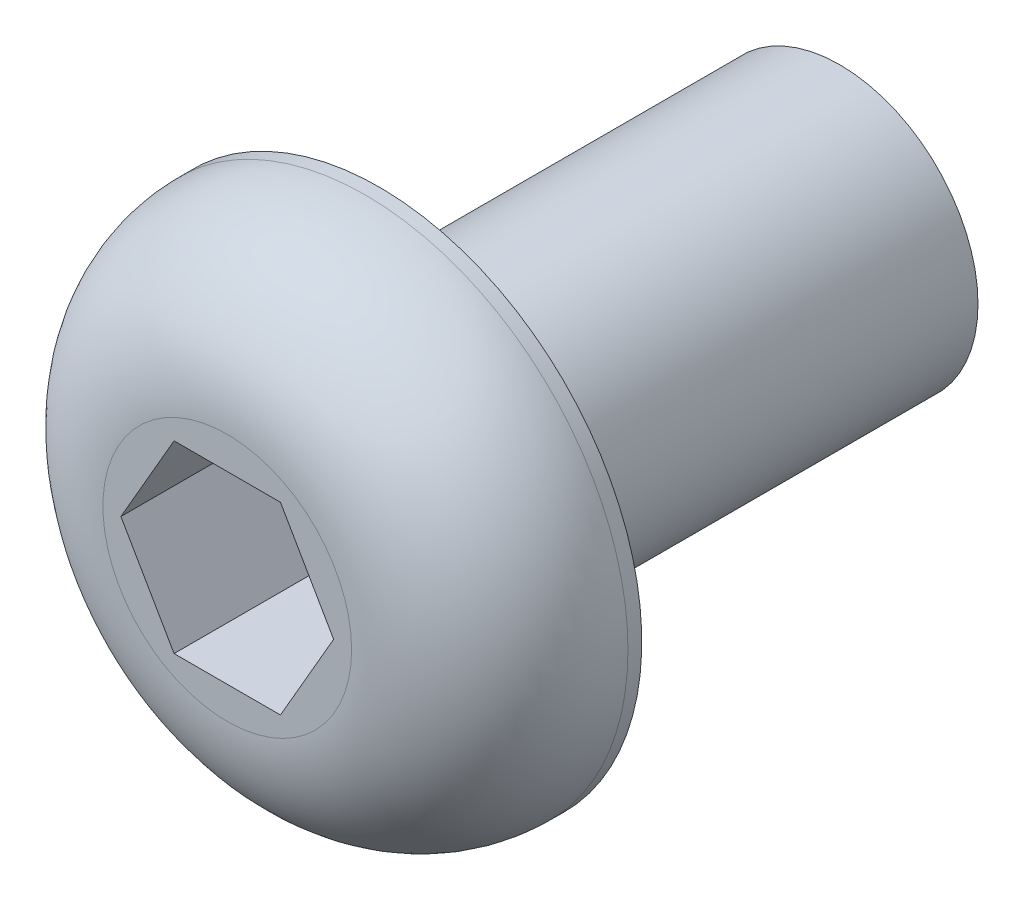
ISO-10303-21;
HEADER;
FILE_DESCRIPTION(('STEP AP214'),'2;1');
FILE_NAME('part.step','',(''),(''),'','','');
FILE_SCHEMA(('AUTOMOTIVE_DESIGN { 1 0 10303 214 1 1 1 1 }'));
ENDSEC;
DATA;
#1=APPLICATION_CONTEXT('core data for automotive mechanical design processes');
#2=APPLICATION_PROTOCOL_DEFINITION('international standard','automotive_design',2000,#1);
#3=PRODUCT_CONTEXT('',#1,'mechanical');
#4=PRODUCT('Part','Part','',(#3));
#5=PRODUCT_RELATED_PRODUCT_CATEGORY('part','',(#4));
#6=PRODUCT_DEFINITION_FORMATION('','',#4);
#7=PRODUCT_DEFINITION_CONTEXT('part definition',#1,'design');
#8=PRODUCT_DEFINITION('design','',#6,#7);
#9=PRODUCT_DEFINITION_SHAPE('','',#8);
#10=(LENGTH_UNIT() NAMED_UNIT(*) SI_UNIT(.MILLI.,.METRE.));
#11=(NAMED_UNIT(*) PLANE_ANGLE_UNIT() SI_UNIT($,.RADIAN.));
#12=(NAMED_UNIT(*) SI_UNIT($,.STERADIAN.) SOLID_ANGLE_UNIT());
#13=UNCERTAINTY_MEASURE_WITH_UNIT(LENGTH_MEASURE(1.E-05),#10,'distance_accuracy_value','');
#14=(GEOMETRIC_REPRESENTATION_CONTEXT(3) GLOBAL_UNCERTAINTY_ASSIGNED_CONTEXT((#13)) GLOBAL_UNIT_ASSIGNED_CONTEXT((#10,
#11,#12)) REPRESENTATION_CONTEXT('',''));
#15=CARTESIAN_POINT('',(0.,0.,0.));
#16=DIRECTION('',(0.,0.,1.));
#17=DIRECTION('',(1.,0.,0.));
#18=AXIS2_PLACEMENT_3D('',#15,#16,#17);
#19=CARTESIAN_POINT('',(1.518,-1.518,-5.));
#20=DIRECTION('',(0.,0.,-1.));
#21=DIRECTION('',(-1.,0.,0.));
#22=AXIS2_PLACEMENT_3D('',#19,#20,#21);
#23=PLANE('',#22);
#24=CARTESIAN_POINT('',(0.,0.,-5.));
#25=DIRECTION('',(0.,0.,1.));
#26=DIRECTION('',(0.,-1.,0.));
#27=AXIS2_PLACEMENT_3D('',#24,#25,#26);
#28=CIRCLE('',#27,1.5);
#29=CARTESIAN_POINT('',(0.,-1.5,-5.));
#30=VERTEX_POINT('',#29);
#31=EDGE_CURVE('E21',#30,#30,#28,.F.);
#32=ORIENTED_EDGE('',*,*,#31,.T.);
#33=EDGE_LOOP('',(#32));
#34=FACE_BOUND('',#33,.T.);
#35=ADVANCED_FACE('F17',(#34),#23,.T.);
#36=CARTESIAN_POINT('',(0.,0.,-5.));
#37=DIRECTION('',(0.,0.,1.));
#38=DIRECTION('',(0.,-1.,0.));
#39=AXIS2_PLACEMENT_3D('',#36,#37,#38);
#40=CYLINDRICAL_SURFACE('',#39,1.5);
#41=ORIENTED_EDGE('',*,*,#31,.F.);
#42=EDGE_LOOP('',(#41));
#43=FACE_BOUND('',#42,.T.);
#44=CARTESIAN_POINT('',(0.,0.,0.));
#45=DIRECTION('',(0.,0.,1.));
#46=DIRECTION('',(0.,-1.,0.));
#47=AXIS2_PLACEMENT_3D('',#44,#45,#46);
#48=CIRCLE('',#47,1.5);
#49=CARTESIAN_POINT('',(0.,-1.5,0.));
#50=VERTEX_POINT('',#49);
#51=EDGE_CURVE('E90',#50,#50,#48,.F.);
#52=ORIENTED_EDGE('',*,*,#51,.T.);
#53=EDGE_LOOP('',(#52));
#54=FACE_BOUND('',#53,.T.);
#55=ADVANCED_FACE('F127',(#43,#54),#40,.T.);
#56=CARTESIAN_POINT('',(1.154700538,-1.,0.05));
#57=DIRECTION('',(0.,0.,-1.));
#58=DIRECTION('',(-1.,0.,0.));
#59=AXIS2_PLACEMENT_3D('',#56,#57,#58);
#60=PLANE('',#59);
#61=DIRECTION('',(-1.,0.,0.));
#62=VECTOR('',#61,1.);
#63=CARTESIAN_POINT('',(0.,1.,0.05));
#64=LINE('',#63,#62);
#65=CARTESIAN_POINT('',(0.577350269,1.,0.05));
#66=VERTEX_POINT('',#65);
#67=CARTESIAN_POINT('',(-0.577350269,1.,0.05));
#68=VERTEX_POINT('',#67);
#69=EDGE_CURVE('E65',#66,#68,#64,.T.);
#70=ORIENTED_EDGE('',*,*,#69,.T.);
#71=DIRECTION('',(-0.499999999876835,-0.866025403855548,0.));
#72=VECTOR('',#71,1.);
#73=CARTESIAN_POINT('',(-0.8660254035,0.5,0.05));
#74=LINE('',#73,#72);
#75=CARTESIAN_POINT('',(-1.15470053767725,-5.59017025378306E-10,0.05));
#76=VERTEX_POINT('',#75);
#77=EDGE_CURVE('E108',#68,#76,#74,.T.);
#78=ORIENTED_EDGE('',*,*,#77,.T.);
#79=DIRECTION('',(0.499999999876835,-0.866025403855548,0.));
#80=VECTOR('',#79,1.);
#81=CARTESIAN_POINT('',(-0.8660254035,-0.5,0.05));
#82=LINE('',#81,#80);
#83=CARTESIAN_POINT('',(-0.577350269,-1.,0.05));
#84=VERTEX_POINT('',#83);
#85=EDGE_CURVE('E102',#76,#84,#82,.T.);
#86=ORIENTED_EDGE('',*,*,#85,.T.);
#87=DIRECTION('',(1.,0.,0.));
#88=VECTOR('',#87,1.);
#89=CARTESIAN_POINT('',(0.,-1.,0.05));
#90=LINE('',#89,#88);
#91=CARTESIAN_POINT('',(0.577350269,-1.,0.05));
#92=VERTEX_POINT('',#91);
#93=EDGE_CURVE('E76',#84,#92,#90,.T.);
#94=ORIENTED_EDGE('',*,*,#93,.T.);
#95=DIRECTION('',(0.499999999876835,0.866025403855548,0.));
#96=VECTOR('',#95,1.);
#97=CARTESIAN_POINT('',(0.8660254035,-0.5,0.05));
#98=LINE('',#97,#96);
#99=CARTESIAN_POINT('',(1.15470053767725,-5.59017025378306E-10,0.05));
#100=VERTEX_POINT('',#99);
#101=EDGE_CURVE('E78',#92,#100,#98,.T.);
#102=ORIENTED_EDGE('',*,*,#101,.T.);
#103=DIRECTION('',(-0.499999999876835,0.866025403855548,0.));
#104=VECTOR('',#103,1.);
#105=CARTESIAN_POINT('',(0.8660254035,0.5,0.05));
#106=LINE('',#105,#104);
#107=EDGE_CURVE('E81',#100,#66,#106,.T.);
#108=ORIENTED_EDGE('',*,*,#107,.T.);
#109=EDGE_LOOP('',(#70,#78,#86,#94,#102,#108));
#110=FACE_BOUND('',#109,.T.);
#111=ADVANCED_FACE('F80',(#110),#60,.F.);
#112=CARTESIAN_POINT('',(-2.8842,-2.8842,0.));
#113=DIRECTION('',(0.,0.,1.));
#114=DIRECTION('',(1.,0.,0.));
#115=AXIS2_PLACEMENT_3D('',#112,#113,#114);
#116=PLANE('',#115);
#117=ORIENTED_EDGE('',*,*,#51,.F.);
#118=EDGE_LOOP('',(#117));
#119=FACE_BOUND('',#118,.T.);
#120=CARTESIAN_POINT('',(0.,0.,0.));
#121=DIRECTION('',(0.,0.,-1.));
#122=DIRECTION('',(-1.,0.,0.));
#123=AXIS2_PLACEMENT_3D('',#120,#121,#122);
#124=CIRCLE('',#123,2.85);
#125=CARTESIAN_POINT('',(-2.85,0.,0.));
#126=VERTEX_POINT('',#125);
#127=EDGE_CURVE('E118',#126,#126,#124,.T.);
#128=ORIENTED_EDGE('',*,*,#127,.T.);
#129=EDGE_LOOP('',(#128));
#130=FACE_BOUND('',#129,.T.);
#131=ADVANCED_FACE('F135',(#119,#130),#116,.F.);
#132=CARTESIAN_POINT('',(1.154700538,0.,0.05));
#133=DIRECTION('',(0.866025403855548,0.499999999876835,0.));
#134=DIRECTION('',(-0.499999999876835,0.866025403855548,0.));
#135=AXIS2_PLACEMENT_3D('',#132,#133,#134);
#136=PLANE('',#135);
#137=DIRECTION('',(0.,0.,-1.));
#138=VECTOR('',#137,1.);
#139=CARTESIAN_POINT('',(0.577350269,1.,0.85));
#140=LINE('',#139,#138);
#141=CARTESIAN_POINT('',(0.5773502694658,1.0000000003111,1.65));
#142=VERTEX_POINT('',#141);
#143=EDGE_CURVE('E89',#142,#66,#140,.T.);
#144=ORIENTED_EDGE('',*,*,#143,.T.);
#145=ORIENTED_EDGE('',*,*,#107,.F.);
#146=DIRECTION('',(0.,0.,1.));
#147=VECTOR('',#146,1.);
#148=CARTESIAN_POINT('',(1.154700538,0.,0.85));
#149=LINE('',#148,#147);
#150=CARTESIAN_POINT('',(1.15470053740243,-9.40933987246678E-11,1.65));
#151=VERTEX_POINT('',#150);
#152=EDGE_CURVE('E85',#100,#151,#149,.T.);
#153=ORIENTED_EDGE('',*,*,#152,.T.);
#154=DIRECTION('',(0.49999999855163,-0.866025404620655,0.));
#155=VECTOR('',#154,1.);
#156=CARTESIAN_POINT('',(0.5773502699316,1.0000000004148,1.65));
#157=LINE('',#156,#155);
#158=EDGE_CURVE('E56',#142,#151,#157,.T.);
#159=ORIENTED_EDGE('',*,*,#158,.F.);
#160=EDGE_LOOP('',(#144,#145,#153,#159));
#161=FACE_BOUND('',#160,.T.);
#162=ADVANCED_FACE('F87',(#161),#136,.F.);
#163=CARTESIAN_POINT('',(0.577350269,-1.,0.05));
#164=DIRECTION('',(0.866025403855548,-0.499999999876835,0.));
#165=DIRECTION('',(0.499999999876835,0.866025403855548,0.));
#166=AXIS2_PLACEMENT_3D('',#163,#164,#165);
#167=PLANE('',#166);
#168=ORIENTED_EDGE('',*,*,#152,.F.);
#169=ORIENTED_EDGE('',*,*,#101,.F.);
#170=DIRECTION('',(0.,0.,1.));
#171=VECTOR('',#170,1.);
#172=CARTESIAN_POINT('',(0.577350269,-1.,0.85));
#173=LINE('',#172,#171);
#174=CARTESIAN_POINT('',(0.5773502694658,-1.0000000003111,1.65));
#175=VERTEX_POINT('',#174);
#176=EDGE_CURVE('E96',#92,#175,#173,.T.);
#177=ORIENTED_EDGE('',*,*,#176,.T.);
#178=DIRECTION('',(-0.49999999855163,-0.866025404620655,0.));
#179=VECTOR('',#178,1.);
#180=CARTESIAN_POINT('',(1.1547005371308,0.,1.65));
#181=LINE('',#180,#179);
#182=EDGE_CURVE('E94',#151,#175,#181,.T.);
#183=ORIENTED_EDGE('',*,*,#182,.F.);
#184=EDGE_LOOP('',(#168,#169,#177,#183));
#185=FACE_BOUND('',#184,.T.);
#186=ADVANCED_FACE('F92',(#185),#167,.F.);
#187=CARTESIAN_POINT('',(-0.577350269,-1.,1.65));
#188=DIRECTION('',(0.,-1.,0.));
#189=DIRECTION('',(0.,0.,-1.));
#190=AXIS2_PLACEMENT_3D('',#187,#188,#189);
#191=PLANE('',#190);
#192=ORIENTED_EDGE('',*,*,#176,.F.);
#193=ORIENTED_EDGE('',*,*,#93,.F.);
#194=DIRECTION('',(0.,0.,1.));
#195=VECTOR('',#194,1.);
#196=CARTESIAN_POINT('',(-0.577350269,-1.,0.85));
#197=LINE('',#196,#195);
#198=CARTESIAN_POINT('',(-0.5773502694658,-1.0000000003111,1.65));
#199=VERTEX_POINT('',#198);
#200=EDGE_CURVE('E107',#84,#199,#197,.T.);
#201=ORIENTED_EDGE('',*,*,#200,.T.);
#202=DIRECTION('',(-1.,0.,0.));
#203=VECTOR('',#202,1.);
#204=CARTESIAN_POINT('',(0.,-1.0000000004148,1.65));
#205=LINE('',#204,#203);
#206=EDGE_CURVE('E103',#175,#199,#205,.T.);
#207=ORIENTED_EDGE('',*,*,#206,.F.);
#208=EDGE_LOOP('',(#192,#193,#201,#207));
#209=FACE_BOUND('',#208,.T.);
#210=ADVANCED_FACE('F170',(#209),#191,.F.);
#211=CARTESIAN_POINT('',(-1.154700538,0.,0.05));
#212=DIRECTION('',(-0.866025403855548,-0.499999999876835,0.));
#213=DIRECTION('',(0.499999999876835,-0.866025403855548,0.));
#214=AXIS2_PLACEMENT_3D('',#211,#212,#213);
#215=PLANE('',#214);
#216=ORIENTED_EDGE('',*,*,#200,.F.);
#217=ORIENTED_EDGE('',*,*,#85,.F.);
#218=DIRECTION('',(0.,0.,1.));
#219=VECTOR('',#218,1.);
#220=CARTESIAN_POINT('',(-1.154700538,0.,0.85));
#221=LINE('',#220,#219);
#222=CARTESIAN_POINT('',(-1.15470053740243,9.40937636698738E-11,1.65));
#223=VERTEX_POINT('',#222);
#224=EDGE_CURVE('E157',#76,#223,#221,.T.);
#225=ORIENTED_EDGE('',*,*,#224,.T.);
#226=DIRECTION('',(-0.499999998551631,0.866025404620655,0.));
#227=VECTOR('',#226,1.);
#228=CARTESIAN_POINT('',(-0.5773502699316,-1.0000000004148,1.65));
#229=LINE('',#228,#227);
#230=EDGE_CURVE('E106',#199,#223,#229,.T.);
#231=ORIENTED_EDGE('',*,*,#230,.F.);
#232=EDGE_LOOP('',(#216,#217,#225,#231));
#233=FACE_BOUND('',#232,.T.);
#234=ADVANCED_FACE('F165',(#233),#215,.F.);
#235=CARTESIAN_POINT('',(-0.577350269,1.,0.05));
#236=DIRECTION('',(-0.866025403855548,0.499999999876835,0.));
#237=DIRECTION('',(-0.499999999876835,-0.866025403855548,0.));
#238=AXIS2_PLACEMENT_3D('',#235,#236,#237);
#239=PLANE('',#238);
#240=ORIENTED_EDGE('',*,*,#224,.F.);
#241=ORIENTED_EDGE('',*,*,#77,.F.);
#242=DIRECTION('',(0.,0.,1.));
#243=VECTOR('',#242,1.);
#244=CARTESIAN_POINT('',(-0.577350269,1.,0.85));
#245=LINE('',#244,#243);
#246=CARTESIAN_POINT('',(-0.5773502694658,1.0000000003111,1.65));
#247=VERTEX_POINT('',#246);
#248=EDGE_CURVE('E36',#68,#247,#245,.T.);
#249=ORIENTED_EDGE('',*,*,#248,.T.);
#250=DIRECTION('',(0.49999999855163,0.866025404620655,0.));
#251=VECTOR('',#250,1.);
#252=CARTESIAN_POINT('',(-1.1547005371308,0.,1.65));
#253=LINE('',#252,#251);
#254=EDGE_CURVE('E110',#223,#247,#253,.T.);
#255=ORIENTED_EDGE('',*,*,#254,.F.);
#256=EDGE_LOOP('',(#240,#241,#249,#255));
#257=FACE_BOUND('',#256,.T.);
#258=ADVANCED_FACE('F166',(#257),#239,.F.);
#259=CARTESIAN_POINT('',(0.577350269,1.,0.05));
#260=DIRECTION('',(0.,1.,0.));
#261=DIRECTION('',(-1.,0.,0.));
#262=AXIS2_PLACEMENT_3D('',#259,#260,#261);
#263=PLANE('',#262);
#264=ORIENTED_EDGE('',*,*,#248,.F.);
#265=ORIENTED_EDGE('',*,*,#69,.F.);
#266=ORIENTED_EDGE('',*,*,#143,.F.);
#267=DIRECTION('',(1.,0.,0.));
#268=VECTOR('',#267,1.);
#269=CARTESIAN_POINT('',(0.,1.0000000004148,1.65));
#270=LINE('',#269,#268);
#271=EDGE_CURVE('E113',#247,#142,#270,.T.);
#272=ORIENTED_EDGE('',*,*,#271,.F.);
#273=EDGE_LOOP('',(#264,#265,#266,#272));
#274=FACE_BOUND('',#273,.T.);
#275=ADVANCED_FACE('F183',(#274),#263,.F.);
#276=CARTESIAN_POINT('',(0.,0.,0.15));
#277=DIRECTION('',(0.,0.,-1.));
#278=DIRECTION('',(-1.,0.,0.));
#279=AXIS2_PLACEMENT_3D('',#276,#277,#278);
#280=CYLINDRICAL_SURFACE('',#279,2.85);
#281=ORIENTED_EDGE('',*,*,#127,.F.);
#282=EDGE_LOOP('',(#281));
#283=FACE_BOUND('',#282,.T.);
#284=CARTESIAN_POINT('',(0.,0.,0.15));
#285=DIRECTION('',(0.,0.,1.));
#286=DIRECTION('',(1.,0.,0.));
#287=AXIS2_PLACEMENT_3D('',#284,#285,#286);
#288=CIRCLE('',#287,2.85);
#289=CARTESIAN_POINT('',(2.85,0.,0.15));
#290=VERTEX_POINT('',#289);
#291=EDGE_CURVE('E27',#290,#290,#288,.T.);
#292=ORIENTED_EDGE('',*,*,#291,.F.);
#293=EDGE_LOOP('',(#292));
#294=FACE_BOUND('',#293,.T.);
#295=ADVANCED_FACE('F145',(#283,#294),#280,.T.);
#296=CARTESIAN_POINT('',(-1.3662,-1.3662,1.65));
#297=DIRECTION('',(0.,0.,1.));
#298=DIRECTION('',(1.,0.,0.));
#299=AXIS2_PLACEMENT_3D('',#296,#297,#298);
#300=PLANE('',#299);
#301=ORIENTED_EDGE('',*,*,#254,.T.);
#302=ORIENTED_EDGE('',*,*,#271,.T.);
#303=ORIENTED_EDGE('',*,*,#158,.T.);
#304=ORIENTED_EDGE('',*,*,#182,.T.);
#305=ORIENTED_EDGE('',*,*,#206,.T.);
#306=ORIENTED_EDGE('',*,*,#230,.T.);
#307=EDGE_LOOP('',(#301,#302,#303,#304,#305,#306));
#308=FACE_BOUND('',#307,.T.);
#309=CARTESIAN_POINT('',(0.,0.,1.65));
#310=DIRECTION('',(0.,0.,1.));
#311=DIRECTION('',(1.,0.,0.));
#312=AXIS2_PLACEMENT_3D('',#309,#310,#311);
#313=CIRCLE('',#312,1.35000000000014);
#314=CARTESIAN_POINT('',(1.35000000000014,0.,1.65));
#315=VERTEX_POINT('',#314);
#316=EDGE_CURVE('E11',#315,#315,#313,.F.);
#317=ORIENTED_EDGE('',*,*,#316,.F.);
#318=EDGE_LOOP('',(#317));
#319=FACE_BOUND('',#318,.T.);
#320=ADVANCED_FACE('F140',(#308,#319),#300,.T.);
#321=CARTESIAN_POINT('',(0.,0.,0.15));
#322=DIRECTION('',(0.,0.,1.));
#323=DIRECTION('',(1.,0.,0.));
#324=AXIS2_PLACEMENT_3D('',#321,#322,#323);
#325=DEGENERATE_TOROIDAL_SURFACE('',#324,1.35,1.5,.T.);
#326=ORIENTED_EDGE('',*,*,#316,.T.);
#327=EDGE_LOOP('',(#326));
#328=FACE_BOUND('',#327,.T.);
#329=ORIENTED_EDGE('',*,*,#291,.T.);
#330=EDGE_LOOP('',(#329));
#331=FACE_BOUND('',#330,.T.);
#332=ADVANCED_FACE('F19',(#328,#331),#325,.T.);
#333=CLOSED_SHELL('',(#35,#55,#111,#131,#162,#186,#210,#234,#258,#275,#295,#320,#332));
#334=MANIFOLD_SOLID_BREP('B1',#333);
#335=ADVANCED_BREP_SHAPE_REPRESENTATION('',(#18,#334),#14);
#336=SHAPE_DEFINITION_REPRESENTATION(#9,#335);
ENDSEC;
END-ISO-10303-21;
